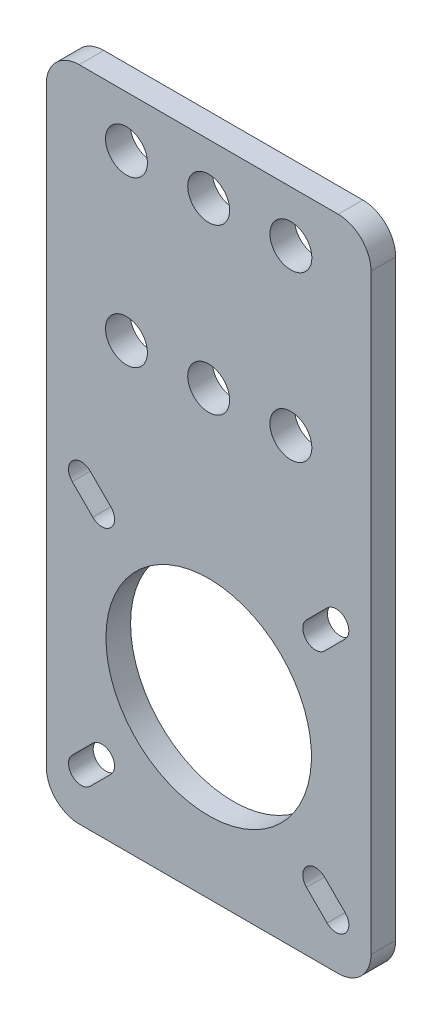
ISO-10303-21;
HEADER;
FILE_DESCRIPTION(('STEP AP214'),'2;1');
FILE_NAME('part.step','',(''),(''),'','','');
FILE_SCHEMA(('AUTOMOTIVE_DESIGN { 1 0 10303 214 1 1 1 1 }'));
ENDSEC;
DATA;
#1=APPLICATION_CONTEXT('core data for automotive mechanical design processes');
#2=APPLICATION_PROTOCOL_DEFINITION('international standard','automotive_design',2000,#1);
#3=PRODUCT_CONTEXT('',#1,'mechanical');
#4=PRODUCT('Part','Part','',(#3));
#5=PRODUCT_RELATED_PRODUCT_CATEGORY('part','',(#4));
#6=PRODUCT_DEFINITION_FORMATION('','',#4);
#7=PRODUCT_DEFINITION_CONTEXT('part definition',#1,'design');
#8=PRODUCT_DEFINITION('design','',#6,#7);
#9=PRODUCT_DEFINITION_SHAPE('','',#8);
#10=(LENGTH_UNIT() NAMED_UNIT(*) SI_UNIT(.MILLI.,.METRE.));
#11=(NAMED_UNIT(*) PLANE_ANGLE_UNIT() SI_UNIT($,.RADIAN.));
#12=(NAMED_UNIT(*) SI_UNIT($,.STERADIAN.) SOLID_ANGLE_UNIT());
#13=UNCERTAINTY_MEASURE_WITH_UNIT(LENGTH_MEASURE(1.E-05),#10,'distance_accuracy_value','');
#14=(GEOMETRIC_REPRESENTATION_CONTEXT(3) GLOBAL_UNCERTAINTY_ASSIGNED_CONTEXT((#13)) GLOBAL_UNIT_ASSIGNED_CONTEXT((#10,
#11,#12)) REPRESENTATION_CONTEXT('',''));
#15=CARTESIAN_POINT('',(0.,0.,0.));
#16=DIRECTION('',(0.,0.,1.));
#17=DIRECTION('',(1.,0.,0.));
#18=AXIS2_PLACEMENT_3D('',#15,#16,#17);
#19=CARTESIAN_POINT('',(0.,52.55,0.));
#20=DIRECTION('',(0.,0.,-1.));
#21=DIRECTION('',(1.,0.,0.));
#22=AXIS2_PLACEMENT_3D('',#19,#20,#21);
#23=CYLINDRICAL_SURFACE('',#22,2.55);
#24=CARTESIAN_POINT('',(0.,52.55,3.));
#25=DIRECTION('',(0.,0.,1.));
#26=DIRECTION('',(1.,0.,0.));
#27=AXIS2_PLACEMENT_3D('',#24,#25,#26);
#28=CIRCLE('',#27,2.55);
#29=CARTESIAN_POINT('',(-2.55,52.55,3.));
#30=VERTEX_POINT('',#29);
#31=EDGE_CURVE('E333',#30,#30,#28,.T.);
#32=ORIENTED_EDGE('',*,*,#31,.T.);
#33=DIRECTION('',(0.,0.,-1.));
#34=VECTOR('',#33,1.);
#35=CARTESIAN_POINT('',(-2.55,52.55,0.));
#36=LINE('',#35,#34);
#37=CARTESIAN_POINT('',(-2.55,52.55,0.));
#38=VERTEX_POINT('',#37);
#39=EDGE_CURVE('E11',#30,#38,#36,.T.);
#40=ORIENTED_EDGE('',*,*,#39,.T.);
#41=CARTESIAN_POINT('',(0.,52.55,0.));
#42=DIRECTION('',(0.,0.,1.));
#43=DIRECTION('',(1.,0.,0.));
#44=AXIS2_PLACEMENT_3D('',#41,#42,#43);
#45=CIRCLE('',#44,2.55);
#46=EDGE_CURVE('E365',#38,#38,#45,.T.);
#47=ORIENTED_EDGE('',*,*,#46,.F.);
#48=ORIENTED_EDGE('',*,*,#39,.F.);
#49=EDGE_LOOP('',(#32,#40,#47,#48));
#50=FACE_BOUND('',#49,.T.);
#51=ADVANCED_FACE('F17',(#50),#23,.F.);
#52=CARTESIAN_POINT('',(0.,32.55,0.));
#53=DIRECTION('',(0.,0.,-1.));
#54=DIRECTION('',(1.,0.,0.));
#55=AXIS2_PLACEMENT_3D('',#52,#53,#54);
#56=CYLINDRICAL_SURFACE('',#55,2.55);
#57=CARTESIAN_POINT('',(0.,32.55,3.));
#58=DIRECTION('',(0.,0.,1.));
#59=DIRECTION('',(1.,0.,0.));
#60=AXIS2_PLACEMENT_3D('',#57,#58,#59);
#61=CIRCLE('',#60,2.55);
#62=CARTESIAN_POINT('',(-2.55,32.55,3.));
#63=VERTEX_POINT('',#62);
#64=EDGE_CURVE('E402',#63,#63,#61,.T.);
#65=ORIENTED_EDGE('',*,*,#64,.T.);
#66=DIRECTION('',(0.,0.,-1.));
#67=VECTOR('',#66,1.);
#68=CARTESIAN_POINT('',(-2.55,32.55,0.));
#69=LINE('',#68,#67);
#70=CARTESIAN_POINT('',(-2.55,32.55,0.));
#71=VERTEX_POINT('',#70);
#72=EDGE_CURVE('E25',#63,#71,#69,.T.);
#73=ORIENTED_EDGE('',*,*,#72,.T.);
#74=CARTESIAN_POINT('',(0.,32.55,0.));
#75=DIRECTION('',(0.,0.,1.));
#76=DIRECTION('',(1.,0.,0.));
#77=AXIS2_PLACEMENT_3D('',#74,#75,#76);
#78=CIRCLE('',#77,2.55);
#79=EDGE_CURVE('E411',#71,#71,#78,.T.);
#80=ORIENTED_EDGE('',*,*,#79,.F.);
#81=ORIENTED_EDGE('',*,*,#72,.F.);
#82=EDGE_LOOP('',(#65,#73,#80,#81));
#83=FACE_BOUND('',#82,.T.);
#84=ADVANCED_FACE('F633',(#83),#56,.F.);
#85=CARTESIAN_POINT('',(-10.,52.55,0.));
#86=DIRECTION('',(0.,0.,-1.));
#87=DIRECTION('',(1.,0.,0.));
#88=AXIS2_PLACEMENT_3D('',#85,#86,#87);
#89=CYLINDRICAL_SURFACE('',#88,2.55);
#90=CARTESIAN_POINT('',(-10.,52.55,3.));
#91=DIRECTION('',(0.,0.,1.));
#92=DIRECTION('',(1.,0.,0.));
#93=AXIS2_PLACEMENT_3D('',#90,#91,#92);
#94=CIRCLE('',#93,2.55);
#95=CARTESIAN_POINT('',(-12.55,52.55,3.));
#96=VERTEX_POINT('',#95);
#97=EDGE_CURVE('E406',#96,#96,#94,.T.);
#98=ORIENTED_EDGE('',*,*,#97,.T.);
#99=DIRECTION('',(0.,0.,-1.));
#100=VECTOR('',#99,1.);
#101=CARTESIAN_POINT('',(-12.55,52.55,0.));
#102=LINE('',#101,#100);
#103=CARTESIAN_POINT('',(-12.55,52.55,0.));
#104=VERTEX_POINT('',#103);
#105=EDGE_CURVE('E527',#96,#104,#102,.T.);
#106=ORIENTED_EDGE('',*,*,#105,.T.);
#107=CARTESIAN_POINT('',(-10.,52.55,0.));
#108=DIRECTION('',(0.,0.,1.));
#109=DIRECTION('',(1.,0.,0.));
#110=AXIS2_PLACEMENT_3D('',#107,#108,#109);
#111=CIRCLE('',#110,2.55);
#112=EDGE_CURVE('E414',#104,#104,#111,.T.);
#113=ORIENTED_EDGE('',*,*,#112,.F.);
#114=ORIENTED_EDGE('',*,*,#105,.F.);
#115=EDGE_LOOP('',(#98,#106,#113,#114));
#116=FACE_BOUND('',#115,.T.);
#117=ADVANCED_FACE('F696',(#116),#89,.F.);
#118=CARTESIAN_POINT('',(-10.,32.55,0.));
#119=DIRECTION('',(0.,0.,-1.));
#120=DIRECTION('',(1.,0.,0.));
#121=AXIS2_PLACEMENT_3D('',#118,#119,#120);
#122=CYLINDRICAL_SURFACE('',#121,2.55);
#123=CARTESIAN_POINT('',(-10.,32.55,3.));
#124=DIRECTION('',(0.,0.,1.));
#125=DIRECTION('',(1.,0.,0.));
#126=AXIS2_PLACEMENT_3D('',#123,#124,#125);
#127=CIRCLE('',#126,2.55);
#128=CARTESIAN_POINT('',(-12.55,32.55,3.));
#129=VERTEX_POINT('',#128);
#130=EDGE_CURVE('E321',#129,#129,#127,.T.);
#131=ORIENTED_EDGE('',*,*,#130,.T.);
#132=DIRECTION('',(0.,0.,-1.));
#133=VECTOR('',#132,1.);
#134=CARTESIAN_POINT('',(-12.55,32.55,0.));
#135=LINE('',#134,#133);
#136=CARTESIAN_POINT('',(-12.55,32.55,0.));
#137=VERTEX_POINT('',#136);
#138=EDGE_CURVE('E357',#129,#137,#135,.T.);
#139=ORIENTED_EDGE('',*,*,#138,.T.);
#140=CARTESIAN_POINT('',(-10.,32.55,0.));
#141=DIRECTION('',(0.,0.,1.));
#142=DIRECTION('',(1.,0.,0.));
#143=AXIS2_PLACEMENT_3D('',#140,#141,#142);
#144=CIRCLE('',#143,2.55);
#145=EDGE_CURVE('E513',#137,#137,#144,.T.);
#146=ORIENTED_EDGE('',*,*,#145,.F.);
#147=ORIENTED_EDGE('',*,*,#138,.F.);
#148=EDGE_LOOP('',(#131,#139,#146,#147));
#149=FACE_BOUND('',#148,.T.);
#150=ADVANCED_FACE('F802',(#149),#122,.F.);
#151=CARTESIAN_POINT('',(10.,52.55,0.));
#152=DIRECTION('',(0.,0.,-1.));
#153=DIRECTION('',(1.,0.,0.));
#154=AXIS2_PLACEMENT_3D('',#151,#152,#153);
#155=CYLINDRICAL_SURFACE('',#154,2.55);
#156=CARTESIAN_POINT('',(10.,52.55,3.));
#157=DIRECTION('',(0.,0.,1.));
#158=DIRECTION('',(1.,0.,0.));
#159=AXIS2_PLACEMENT_3D('',#156,#157,#158);
#160=CIRCLE('',#159,2.55);
#161=CARTESIAN_POINT('',(7.45,52.55,3.));
#162=VERTEX_POINT('',#161);
#163=EDGE_CURVE('E470',#162,#162,#160,.T.);
#164=ORIENTED_EDGE('',*,*,#163,.T.);
#165=DIRECTION('',(0.,0.,-1.));
#166=VECTOR('',#165,1.);
#167=CARTESIAN_POINT('',(7.45,52.55,0.));
#168=LINE('',#167,#166);
#169=CARTESIAN_POINT('',(7.45,52.55,0.));
#170=VERTEX_POINT('',#169);
#171=EDGE_CURVE('E356',#162,#170,#168,.T.);
#172=ORIENTED_EDGE('',*,*,#171,.T.);
#173=CARTESIAN_POINT('',(10.,52.55,0.));
#174=DIRECTION('',(0.,0.,1.));
#175=DIRECTION('',(1.,0.,0.));
#176=AXIS2_PLACEMENT_3D('',#173,#174,#175);
#177=CIRCLE('',#176,2.55);
#178=EDGE_CURVE('E507',#170,#170,#177,.T.);
#179=ORIENTED_EDGE('',*,*,#178,.F.);
#180=ORIENTED_EDGE('',*,*,#171,.F.);
#181=EDGE_LOOP('',(#164,#172,#179,#180));
#182=FACE_BOUND('',#181,.T.);
#183=ADVANCED_FACE('F798',(#182),#155,.F.);
#184=CARTESIAN_POINT('',(10.,32.55,0.));
#185=DIRECTION('',(0.,0.,-1.));
#186=DIRECTION('',(1.,0.,0.));
#187=AXIS2_PLACEMENT_3D('',#184,#185,#186);
#188=CYLINDRICAL_SURFACE('',#187,2.55);
#189=CARTESIAN_POINT('',(10.,32.55,3.));
#190=DIRECTION('',(0.,0.,1.));
#191=DIRECTION('',(1.,0.,0.));
#192=AXIS2_PLACEMENT_3D('',#189,#190,#191);
#193=CIRCLE('',#192,2.55);
#194=CARTESIAN_POINT('',(7.45,32.55,3.));
#195=VERTEX_POINT('',#194);
#196=EDGE_CURVE('E473',#195,#195,#193,.T.);
#197=ORIENTED_EDGE('',*,*,#196,.T.);
#198=DIRECTION('',(0.,0.,-1.));
#199=VECTOR('',#198,1.);
#200=CARTESIAN_POINT('',(7.45,32.55,0.));
#201=LINE('',#200,#199);
#202=CARTESIAN_POINT('',(7.45,32.55,0.));
#203=VERTEX_POINT('',#202);
#204=EDGE_CURVE('E359',#195,#203,#201,.T.);
#205=ORIENTED_EDGE('',*,*,#204,.T.);
#206=CARTESIAN_POINT('',(10.,32.55,0.));
#207=DIRECTION('',(0.,0.,1.));
#208=DIRECTION('',(1.,0.,0.));
#209=AXIS2_PLACEMENT_3D('',#206,#207,#208);
#210=CIRCLE('',#209,2.55);
#211=EDGE_CURVE('E499',#203,#203,#210,.T.);
#212=ORIENTED_EDGE('',*,*,#211,.F.);
#213=ORIENTED_EDGE('',*,*,#204,.F.);
#214=EDGE_LOOP('',(#197,#205,#212,#213));
#215=FACE_BOUND('',#214,.T.);
#216=ADVANCED_FACE('F793',(#215),#188,.F.);
#217=CARTESIAN_POINT('',(16.596015510839,-14.40398448916,0.));
#218=DIRECTION('',(-0.707106781186548,-0.707106781186548,0.));
#219=DIRECTION('',(-0.707106781186548,0.707106781186548,0.));
#220=AXIS2_PLACEMENT_3D('',#217,#218,#219);
#221=PLANE('',#220);
#222=DIRECTION('',(0.,0.,1.));
#223=VECTOR('',#222,1.);
#224=CARTESIAN_POINT('',(16.596015510839,-14.40398448916,0.));
#225=LINE('',#224,#223);
#226=CARTESIAN_POINT('',(16.596015510839,-14.40398448916,0.));
#227=VERTEX_POINT('',#226);
#228=CARTESIAN_POINT('',(16.596015510839,-14.40398448916,3.));
#229=VERTEX_POINT('',#228);
#230=EDGE_CURVE('E502',#227,#229,#225,.T.);
#231=ORIENTED_EDGE('',*,*,#230,.T.);
#232=DIRECTION('',(-0.707106781186548,0.707106781186548,0.));
#233=VECTOR('',#232,1.);
#234=CARTESIAN_POINT('',(16.596015510839,-14.40398448916,3.));
#235=LINE('',#234,#233);
#236=CARTESIAN_POINT('',(14.096015510839,-11.90398448916,3.));
#237=VERTEX_POINT('',#236);
#238=EDGE_CURVE('E580',#229,#237,#235,.T.);
#239=ORIENTED_EDGE('',*,*,#238,.T.);
#240=DIRECTION('',(0.,0.,1.));
#241=VECTOR('',#240,1.);
#242=CARTESIAN_POINT('',(14.096015510839,-11.90398448916,0.));
#243=LINE('',#242,#241);
#244=CARTESIAN_POINT('',(14.096015510839,-11.90398448916,0.));
#245=VERTEX_POINT('',#244);
#246=EDGE_CURVE('E338',#245,#237,#243,.T.);
#247=ORIENTED_EDGE('',*,*,#246,.F.);
#248=DIRECTION('',(-0.707106781186548,0.707106781186548,0.));
#249=VECTOR('',#248,1.);
#250=CARTESIAN_POINT('',(16.596015510839,-14.40398448916,0.));
#251=LINE('',#250,#249);
#252=EDGE_CURVE('E493',#227,#245,#251,.T.);
#253=ORIENTED_EDGE('',*,*,#252,.F.);
#254=EDGE_LOOP('',(#231,#239,#247,#253));
#255=FACE_BOUND('',#254,.T.);
#256=ADVANCED_FACE('F789',(#255),#221,.T.);
#257=CARTESIAN_POINT('',(15.5,-15.5,0.));
#258=DIRECTION('',(0.,0.,-1.));
#259=DIRECTION('',(1.,0.,0.));
#260=AXIS2_PLACEMENT_3D('',#257,#258,#259);
#261=CYLINDRICAL_SURFACE('',#260,1.55);
#262=DIRECTION('',(0.,0.,1.));
#263=VECTOR('',#262,1.);
#264=CARTESIAN_POINT('',(14.403984489161,-16.59601551083,0.));
#265=LINE('',#264,#263);
#266=CARTESIAN_POINT('',(14.403984489161,-16.59601551083,0.));
#267=VERTEX_POINT('',#266);
#268=CARTESIAN_POINT('',(14.403984489161,-16.59601551083,3.));
#269=VERTEX_POINT('',#268);
#270=EDGE_CURVE('E496',#267,#269,#265,.T.);
#271=ORIENTED_EDGE('',*,*,#270,.T.);
#272=CARTESIAN_POINT('',(15.5,-15.5,3.));
#273=DIRECTION('',(0.,0.,1.));
#274=DIRECTION('',(1.,0.,0.));
#275=AXIS2_PLACEMENT_3D('',#272,#273,#274);
#276=CIRCLE('',#275,1.55);
#277=EDGE_CURVE('E583',#269,#229,#276,.T.);
#278=ORIENTED_EDGE('',*,*,#277,.T.);
#279=ORIENTED_EDGE('',*,*,#230,.F.);
#280=CARTESIAN_POINT('',(15.5,-15.5,0.));
#281=DIRECTION('',(0.,0.,1.));
#282=DIRECTION('',(1.,0.,0.));
#283=AXIS2_PLACEMENT_3D('',#280,#281,#282);
#284=CIRCLE('',#283,1.55);
#285=EDGE_CURVE('E489',#267,#227,#284,.T.);
#286=ORIENTED_EDGE('',*,*,#285,.F.);
#287=EDGE_LOOP('',(#271,#278,#279,#286));
#288=FACE_BOUND('',#287,.T.);
#289=ADVANCED_FACE('F790',(#288),#261,.F.);
#290=CARTESIAN_POINT('',(11.903984489161,-14.09601551083,0.));
#291=DIRECTION('',(0.707106781186548,0.707106781186548,0.));
#292=DIRECTION('',(0.,0.,-1.));
#293=AXIS2_PLACEMENT_3D('',#290,#291,#292);
#294=PLANE('',#293);
#295=DIRECTION('',(0.,0.,1.));
#296=VECTOR('',#295,1.);
#297=CARTESIAN_POINT('',(11.903984489161,-14.09601551083,0.));
#298=LINE('',#297,#296);
#299=CARTESIAN_POINT('',(11.903984489161,-14.09601551083,0.));
#300=VERTEX_POINT('',#299);
#301=CARTESIAN_POINT('',(11.903984489161,-14.09601551083,3.));
#302=VERTEX_POINT('',#301);
#303=EDGE_CURVE('E345',#300,#302,#298,.T.);
#304=ORIENTED_EDGE('',*,*,#303,.T.);
#305=DIRECTION('',(0.707106781186548,-0.707106781186548,0.));
#306=VECTOR('',#305,1.);
#307=CARTESIAN_POINT('',(11.903984489161,-14.09601551083,3.));
#308=LINE('',#307,#306);
#309=EDGE_CURVE('E584',#302,#269,#308,.T.);
#310=ORIENTED_EDGE('',*,*,#309,.T.);
#311=ORIENTED_EDGE('',*,*,#270,.F.);
#312=DIRECTION('',(0.707106781186548,-0.707106781186548,0.));
#313=VECTOR('',#312,1.);
#314=CARTESIAN_POINT('',(11.903984489161,-14.09601551083,0.));
#315=LINE('',#314,#313);
#316=EDGE_CURVE('E474',#300,#267,#315,.T.);
#317=ORIENTED_EDGE('',*,*,#316,.F.);
#318=EDGE_LOOP('',(#304,#310,#311,#317));
#319=FACE_BOUND('',#318,.T.);
#320=ADVANCED_FACE('F785',(#319),#294,.T.);
#321=CARTESIAN_POINT('',(13.,-13.,0.));
#322=DIRECTION('',(0.,0.,-1.));
#323=DIRECTION('',(-0.707106781185256,0.707106781187839,0.));
#324=AXIS2_PLACEMENT_3D('',#321,#322,#323);
#325=CYLINDRICAL_SURFACE('',#324,1.55);
#326=ORIENTED_EDGE('',*,*,#246,.T.);
#327=CARTESIAN_POINT('',(13.,-13.,3.));
#328=DIRECTION('',(0.,0.,1.));
#329=DIRECTION('',(1.,0.,0.));
#330=AXIS2_PLACEMENT_3D('',#327,#328,#329);
#331=CIRCLE('',#330,1.55);
#332=EDGE_CURVE('E433',#237,#302,#331,.T.);
#333=ORIENTED_EDGE('',*,*,#332,.T.);
#334=ORIENTED_EDGE('',*,*,#303,.F.);
#335=CARTESIAN_POINT('',(13.,-13.,0.));
#336=DIRECTION('',(0.,0.,1.));
#337=DIRECTION('',(1.,0.,0.));
#338=AXIS2_PLACEMENT_3D('',#335,#336,#337);
#339=CIRCLE('',#338,1.55);
#340=EDGE_CURVE('E466',#245,#300,#339,.T.);
#341=ORIENTED_EDGE('',*,*,#340,.F.);
#342=EDGE_LOOP('',(#326,#333,#334,#341));
#343=FACE_BOUND('',#342,.T.);
#344=ADVANCED_FACE('F779',(#343),#325,.F.);
#345=CARTESIAN_POINT('',(14.403984489161,16.596015510839,0.));
#346=DIRECTION('',(0.707106781186548,-0.707106781186548,0.));
#347=DIRECTION('',(0.,0.,-1.));
#348=AXIS2_PLACEMENT_3D('',#345,#346,#347);
#349=PLANE('',#348);
#350=DIRECTION('',(0.,0.,1.));
#351=VECTOR('',#350,1.);
#352=CARTESIAN_POINT('',(14.403984489161,16.596015510839,0.));
#353=LINE('',#352,#351);
#354=CARTESIAN_POINT('',(14.403984489161,16.596015510839,0.));
#355=VERTEX_POINT('',#354);
#356=CARTESIAN_POINT('',(14.403984489161,16.596015510839,3.));
#357=VERTEX_POINT('',#356);
#358=EDGE_CURVE('E344',#355,#357,#353,.T.);
#359=ORIENTED_EDGE('',*,*,#358,.T.);
#360=DIRECTION('',(-0.707106781186548,-0.707106781186548,0.));
#361=VECTOR('',#360,1.);
#362=CARTESIAN_POINT('',(14.403984489161,16.596015510839,3.));
#363=LINE('',#362,#361);
#364=CARTESIAN_POINT('',(11.903984489161,14.096015510839,3.));
#365=VERTEX_POINT('',#364);
#366=EDGE_CURVE('E397',#357,#365,#363,.T.);
#367=ORIENTED_EDGE('',*,*,#366,.T.);
#368=DIRECTION('',(0.,0.,1.));
#369=VECTOR('',#368,1.);
#370=CARTESIAN_POINT('',(11.903984489161,14.096015510839,0.));
#371=LINE('',#370,#369);
#372=CARTESIAN_POINT('',(11.903984489161,14.096015510839,0.));
#373=VERTEX_POINT('',#372);
#374=EDGE_CURVE('E589',#373,#365,#371,.T.);
#375=ORIENTED_EDGE('',*,*,#374,.F.);
#376=DIRECTION('',(-0.707106781186548,-0.707106781186548,0.));
#377=VECTOR('',#376,1.);
#378=CARTESIAN_POINT('',(14.403984489161,16.596015510839,0.));
#379=LINE('',#378,#377);
#380=EDGE_CURVE('E457',#355,#373,#379,.T.);
#381=ORIENTED_EDGE('',*,*,#380,.F.);
#382=EDGE_LOOP('',(#359,#367,#375,#381));
#383=FACE_BOUND('',#382,.T.);
#384=ADVANCED_FACE('F771',(#383),#349,.T.);
#385=CARTESIAN_POINT('',(15.5,15.5,0.));
#386=DIRECTION('',(0.,0.,-1.));
#387=DIRECTION('',(1.,0.,0.));
#388=AXIS2_PLACEMENT_3D('',#385,#386,#387);
#389=CYLINDRICAL_SURFACE('',#388,1.55);
#390=DIRECTION('',(0.,0.,1.));
#391=VECTOR('',#390,1.);
#392=CARTESIAN_POINT('',(16.596015510839,14.403984489161,0.));
#393=LINE('',#392,#391);
#394=CARTESIAN_POINT('',(16.596015510839,14.403984489161,0.));
#395=VERTEX_POINT('',#394);
#396=CARTESIAN_POINT('',(16.596015510839,14.403984489161,3.));
#397=VERTEX_POINT('',#396);
#398=EDGE_CURVE('E618',#395,#397,#393,.T.);
#399=ORIENTED_EDGE('',*,*,#398,.T.);
#400=CARTESIAN_POINT('',(15.5,15.5,3.));
#401=DIRECTION('',(0.,0.,1.));
#402=DIRECTION('',(1.,0.,0.));
#403=AXIS2_PLACEMENT_3D('',#400,#401,#402);
#404=CIRCLE('',#403,1.55);
#405=EDGE_CURVE('E398',#397,#357,#404,.T.);
#406=ORIENTED_EDGE('',*,*,#405,.T.);
#407=ORIENTED_EDGE('',*,*,#358,.F.);
#408=CARTESIAN_POINT('',(15.5,15.5,0.));
#409=DIRECTION('',(0.,0.,1.));
#410=DIRECTION('',(1.,0.,0.));
#411=AXIS2_PLACEMENT_3D('',#408,#409,#410);
#412=CIRCLE('',#411,1.55);
#413=EDGE_CURVE('E448',#395,#355,#412,.T.);
#414=ORIENTED_EDGE('',*,*,#413,.F.);
#415=EDGE_LOOP('',(#399,#406,#407,#414));
#416=FACE_BOUND('',#415,.T.);
#417=ADVANCED_FACE('F769',(#416),#389,.F.);
#418=CARTESIAN_POINT('',(14.096015510839,11.903984489161,0.));
#419=DIRECTION('',(-0.707106781186548,0.707106781186548,0.));
#420=DIRECTION('',(0.,0.,1.));
#421=AXIS2_PLACEMENT_3D('',#418,#419,#420);
#422=PLANE('',#421);
#423=DIRECTION('',(0.,0.,1.));
#424=VECTOR('',#423,1.);
#425=CARTESIAN_POINT('',(14.096015510839,11.903984489161,0.));
#426=LINE('',#425,#424);
#427=CARTESIAN_POINT('',(14.096015510839,11.903984489161,0.));
#428=VERTEX_POINT('',#427);
#429=CARTESIAN_POINT('',(14.096015510839,11.903984489161,3.));
#430=VERTEX_POINT('',#429);
#431=EDGE_CURVE('E595',#428,#430,#426,.T.);
#432=ORIENTED_EDGE('',*,*,#431,.T.);
#433=DIRECTION('',(0.707106781186548,0.707106781186548,0.));
#434=VECTOR('',#433,1.);
#435=CARTESIAN_POINT('',(14.096015510839,11.903984489161,3.));
#436=LINE('',#435,#434);
#437=EDGE_CURVE('E427',#430,#397,#436,.T.);
#438=ORIENTED_EDGE('',*,*,#437,.T.);
#439=ORIENTED_EDGE('',*,*,#398,.F.);
#440=DIRECTION('',(0.707106781186548,0.707106781186548,0.));
#441=VECTOR('',#440,1.);
#442=CARTESIAN_POINT('',(14.096015510839,11.903984489161,0.));
#443=LINE('',#442,#441);
#444=EDGE_CURVE('E443',#428,#395,#443,.T.);
#445=ORIENTED_EDGE('',*,*,#444,.F.);
#446=EDGE_LOOP('',(#432,#438,#439,#445));
#447=FACE_BOUND('',#446,.T.);
#448=ADVANCED_FACE('F766',(#447),#422,.T.);
#449=CARTESIAN_POINT('',(13.,13.,0.));
#450=DIRECTION('',(0.,0.,-1.));
#451=DIRECTION('',(-0.707106781186548,-0.707106781186547,0.));
#452=AXIS2_PLACEMENT_3D('',#449,#450,#451);
#453=CYLINDRICAL_SURFACE('',#452,1.55);
#454=ORIENTED_EDGE('',*,*,#374,.T.);
#455=CARTESIAN_POINT('',(13.,13.,3.));
#456=DIRECTION('',(0.,0.,1.));
#457=DIRECTION('',(1.,0.,0.));
#458=AXIS2_PLACEMENT_3D('',#455,#456,#457);
#459=CIRCLE('',#458,1.55);
#460=EDGE_CURVE('E405',#365,#430,#459,.T.);
#461=ORIENTED_EDGE('',*,*,#460,.T.);
#462=ORIENTED_EDGE('',*,*,#431,.F.);
#463=CARTESIAN_POINT('',(13.,13.,0.));
#464=DIRECTION('',(0.,0.,1.));
#465=DIRECTION('',(1.,0.,0.));
#466=AXIS2_PLACEMENT_3D('',#463,#464,#465);
#467=CIRCLE('',#466,1.55);
#468=EDGE_CURVE('E442',#373,#428,#467,.T.);
#469=ORIENTED_EDGE('',*,*,#468,.F.);
#470=EDGE_LOOP('',(#454,#461,#462,#469));
#471=FACE_BOUND('',#470,.T.);
#472=ADVANCED_FACE('F765',(#471),#453,.F.);
#473=CARTESIAN_POINT('',(-14.09601551083,-11.90398448916,0.));
#474=DIRECTION('',(0.707106781186548,-0.707106781186548,0.));
#475=DIRECTION('',(0.,0.,-1.));
#476=AXIS2_PLACEMENT_3D('',#473,#474,#475);
#477=PLANE('',#476);
#478=DIRECTION('',(0.,0.,1.));
#479=VECTOR('',#478,1.);
#480=CARTESIAN_POINT('',(-14.09601551083,-11.90398448916,0.));
#481=LINE('',#480,#479);
#482=CARTESIAN_POINT('',(-14.09601551083,-11.90398448916,0.));
#483=VERTEX_POINT('',#482);
#484=CARTESIAN_POINT('',(-14.09601551083,-11.90398448916,3.));
#485=VERTEX_POINT('',#484);
#486=EDGE_CURVE('E421',#483,#485,#481,.T.);
#487=ORIENTED_EDGE('',*,*,#486,.T.);
#488=DIRECTION('',(-0.707106781186548,-0.707106781186548,0.));
#489=VECTOR('',#488,1.);
#490=CARTESIAN_POINT('',(-14.09601551083,-11.90398448916,3.));
#491=LINE('',#490,#489);
#492=CARTESIAN_POINT('',(-16.59601551083,-14.40398448916,3.));
#493=VERTEX_POINT('',#492);
#494=EDGE_CURVE('E481',#485,#493,#491,.T.);
#495=ORIENTED_EDGE('',*,*,#494,.T.);
#496=DIRECTION('',(0.,0.,1.));
#497=VECTOR('',#496,1.);
#498=CARTESIAN_POINT('',(-16.59601551083,-14.40398448916,0.));
#499=LINE('',#498,#497);
#500=CARTESIAN_POINT('',(-16.59601551083,-14.40398448916,0.));
#501=VERTEX_POINT('',#500);
#502=EDGE_CURVE('E520',#501,#493,#499,.T.);
#503=ORIENTED_EDGE('',*,*,#502,.F.);
#504=DIRECTION('',(-0.707106781186548,-0.707106781186548,0.));
#505=VECTOR('',#504,1.);
#506=CARTESIAN_POINT('',(-14.09601551083,-11.90398448916,0.));
#507=LINE('',#506,#505);
#508=EDGE_CURVE('E440',#483,#501,#507,.T.);
#509=ORIENTED_EDGE('',*,*,#508,.F.);
#510=EDGE_LOOP('',(#487,#495,#503,#509));
#511=FACE_BOUND('',#510,.T.);
#512=ADVANCED_FACE('F758',(#511),#477,.T.);
#513=CARTESIAN_POINT('',(-13.,-13.,0.));
#514=DIRECTION('',(0.,0.,-1.));
#515=DIRECTION('',(1.,0.,0.));
#516=AXIS2_PLACEMENT_3D('',#513,#514,#515);
#517=CYLINDRICAL_SURFACE('',#516,1.55);
#518=DIRECTION('',(0.,0.,1.));
#519=VECTOR('',#518,1.);
#520=CARTESIAN_POINT('',(-11.90398448916,-14.09601551083,0.));
#521=LINE('',#520,#519);
#522=CARTESIAN_POINT('',(-11.90398448916,-14.09601551083,0.));
#523=VERTEX_POINT('',#522);
#524=CARTESIAN_POINT('',(-11.90398448916,-14.09601551083,3.));
#525=VERTEX_POINT('',#524);
#526=EDGE_CURVE('E419',#523,#525,#521,.T.);
#527=ORIENTED_EDGE('',*,*,#526,.T.);
#528=CARTESIAN_POINT('',(-13.,-13.,3.));
#529=DIRECTION('',(0.,0.,1.));
#530=DIRECTION('',(1.,0.,0.));
#531=AXIS2_PLACEMENT_3D('',#528,#529,#530);
#532=CIRCLE('',#531,1.55);
#533=EDGE_CURVE('E484',#525,#485,#532,.T.);
#534=ORIENTED_EDGE('',*,*,#533,.T.);
#535=ORIENTED_EDGE('',*,*,#486,.F.);
#536=CARTESIAN_POINT('',(-13.,-13.,0.));
#537=DIRECTION('',(0.,0.,1.));
#538=DIRECTION('',(1.,0.,0.));
#539=AXIS2_PLACEMENT_3D('',#536,#537,#538);
#540=CIRCLE('',#539,1.55);
#541=EDGE_CURVE('E428',#523,#483,#540,.T.);
#542=ORIENTED_EDGE('',*,*,#541,.F.);
#543=EDGE_LOOP('',(#527,#534,#535,#542));
#544=FACE_BOUND('',#543,.T.);
#545=ADVANCED_FACE('F754',(#544),#517,.F.);
#546=CARTESIAN_POINT('',(-14.40398448916,-16.59601551083,0.));
#547=DIRECTION('',(-0.707106781186548,0.707106781186548,0.));
#548=DIRECTION('',(0.,0.,1.));
#549=AXIS2_PLACEMENT_3D('',#546,#547,#548);
#550=PLANE('',#549);
#551=DIRECTION('',(0.,0.,1.));
#552=VECTOR('',#551,1.);
#553=CARTESIAN_POINT('',(-14.40398448916,-16.59601551083,0.));
#554=LINE('',#553,#552);
#555=CARTESIAN_POINT('',(-14.40398448916,-16.59601551083,0.));
#556=VERTEX_POINT('',#555);
#557=CARTESIAN_POINT('',(-14.40398448916,-16.59601551083,3.));
#558=VERTEX_POINT('',#557);
#559=EDGE_CURVE('E424',#556,#558,#554,.T.);
#560=ORIENTED_EDGE('',*,*,#559,.T.);
#561=DIRECTION('',(0.707106781186548,0.707106781186548,0.));
#562=VECTOR('',#561,1.);
#563=CARTESIAN_POINT('',(-14.40398448916,-16.59601551083,3.));
#564=LINE('',#563,#562);
#565=EDGE_CURVE('E561',#558,#525,#564,.T.);
#566=ORIENTED_EDGE('',*,*,#565,.T.);
#567=ORIENTED_EDGE('',*,*,#526,.F.);
#568=DIRECTION('',(0.707106781186548,0.707106781186548,0.));
#569=VECTOR('',#568,1.);
#570=CARTESIAN_POINT('',(-14.40398448916,-16.59601551083,0.));
#571=LINE('',#570,#569);
#572=EDGE_CURVE('E420',#556,#523,#571,.T.);
#573=ORIENTED_EDGE('',*,*,#572,.F.);
#574=EDGE_LOOP('',(#560,#566,#567,#573));
#575=FACE_BOUND('',#574,.T.);
#576=ADVANCED_FACE('F753',(#575),#550,.T.);
#577=CARTESIAN_POINT('',(-15.5,-15.5,0.));
#578=DIRECTION('',(0.,0.,-1.));
#579=DIRECTION('',(-0.707106781186548,-0.707106781186547,0.));
#580=AXIS2_PLACEMENT_3D('',#577,#578,#579);
#581=CYLINDRICAL_SURFACE('',#580,1.55);
#582=ORIENTED_EDGE('',*,*,#502,.T.);
#583=CARTESIAN_POINT('',(-15.5,-15.5,3.));
#584=DIRECTION('',(0.,0.,1.));
#585=DIRECTION('',(1.,0.,0.));
#586=AXIS2_PLACEMENT_3D('',#583,#584,#585);
#587=CIRCLE('',#586,1.55);
#588=EDGE_CURVE('E486',#493,#558,#587,.T.);
#589=ORIENTED_EDGE('',*,*,#588,.T.);
#590=ORIENTED_EDGE('',*,*,#559,.F.);
#591=CARTESIAN_POINT('',(-15.5,-15.5,0.));
#592=DIRECTION('',(0.,0.,1.));
#593=DIRECTION('',(1.,0.,0.));
#594=AXIS2_PLACEMENT_3D('',#591,#592,#593);
#595=CIRCLE('',#594,1.55);
#596=EDGE_CURVE('E369',#501,#556,#595,.T.);
#597=ORIENTED_EDGE('',*,*,#596,.F.);
#598=EDGE_LOOP('',(#582,#589,#590,#597));
#599=FACE_BOUND('',#598,.T.);
#600=ADVANCED_FACE('F749',(#599),#581,.F.);
#601=CARTESIAN_POINT('',(-11.90398448916,14.096015510839,0.));
#602=DIRECTION('',(-0.707106781186548,-0.707106781186548,0.));
#603=DIRECTION('',(-0.707106781186548,0.707106781186548,0.));
#604=AXIS2_PLACEMENT_3D('',#601,#602,#603);
#605=PLANE('',#604);
#606=DIRECTION('',(0.,0.,1.));
#607=VECTOR('',#606,1.);
#608=CARTESIAN_POINT('',(-11.90398448916,14.096015510839,0.));
#609=LINE('',#608,#607);
#610=CARTESIAN_POINT('',(-11.90398448916,14.096015510839,0.));
#611=VERTEX_POINT('',#610);
#612=CARTESIAN_POINT('',(-11.90398448916,14.096015510839,3.));
#613=VERTEX_POINT('',#612);
#614=EDGE_CURVE('E512',#611,#613,#609,.T.);
#615=ORIENTED_EDGE('',*,*,#614,.T.);
#616=DIRECTION('',(-0.707106781186548,0.707106781186548,0.));
#617=VECTOR('',#616,1.);
#618=CARTESIAN_POINT('',(-11.90398448916,14.096015510839,3.));
#619=LINE('',#618,#617);
#620=CARTESIAN_POINT('',(-14.40398448916,16.596015510839,3.));
#621=VERTEX_POINT('',#620);
#622=EDGE_CURVE('E381',#613,#621,#619,.T.);
#623=ORIENTED_EDGE('',*,*,#622,.T.);
#624=DIRECTION('',(0.,0.,1.));
#625=VECTOR('',#624,1.);
#626=CARTESIAN_POINT('',(-14.40398448916,16.596015510839,0.));
#627=LINE('',#626,#625);
#628=CARTESIAN_POINT('',(-14.40398448916,16.596015510839,0.));
#629=VERTEX_POINT('',#628);
#630=EDGE_CURVE('E479',#629,#621,#627,.T.);
#631=ORIENTED_EDGE('',*,*,#630,.F.);
#632=DIRECTION('',(-0.707106781186548,0.707106781186548,0.));
#633=VECTOR('',#632,1.);
#634=CARTESIAN_POINT('',(-11.90398448916,14.096015510839,0.));
#635=LINE('',#634,#633);
#636=EDGE_CURVE('E364',#611,#629,#635,.T.);
#637=ORIENTED_EDGE('',*,*,#636,.F.);
#638=EDGE_LOOP('',(#615,#623,#631,#637));
#639=FACE_BOUND('',#638,.T.);
#640=ADVANCED_FACE('F731',(#639),#605,.T.);
#641=CARTESIAN_POINT('',(-13.,13.,0.));
#642=DIRECTION('',(0.,0.,-1.));
#643=DIRECTION('',(1.,0.,0.));
#644=AXIS2_PLACEMENT_3D('',#641,#642,#643);
#645=CYLINDRICAL_SURFACE('',#644,1.55);
#646=DIRECTION('',(0.,0.,1.));
#647=VECTOR('',#646,1.);
#648=CARTESIAN_POINT('',(-14.09601551083,11.903984489161,0.));
#649=LINE('',#648,#647);
#650=CARTESIAN_POINT('',(-14.09601551083,11.903984489161,0.));
#651=VERTEX_POINT('',#650);
#652=CARTESIAN_POINT('',(-14.09601551083,11.903984489161,3.));
#653=VERTEX_POINT('',#652);
#654=EDGE_CURVE('E517',#651,#653,#649,.T.);
#655=ORIENTED_EDGE('',*,*,#654,.T.);
#656=CARTESIAN_POINT('',(-13.,13.,3.));
#657=DIRECTION('',(0.,0.,1.));
#658=DIRECTION('',(1.,0.,0.));
#659=AXIS2_PLACEMENT_3D('',#656,#657,#658);
#660=CIRCLE('',#659,1.55);
#661=EDGE_CURVE('E549',#653,#613,#660,.T.);
#662=ORIENTED_EDGE('',*,*,#661,.T.);
#663=ORIENTED_EDGE('',*,*,#614,.F.);
#664=CARTESIAN_POINT('',(-13.,13.,0.));
#665=DIRECTION('',(0.,0.,1.));
#666=DIRECTION('',(1.,0.,0.));
#667=AXIS2_PLACEMENT_3D('',#664,#665,#666);
#668=CIRCLE('',#667,1.55);
#669=EDGE_CURVE('E328',#651,#611,#668,.T.);
#670=ORIENTED_EDGE('',*,*,#669,.F.);
#671=EDGE_LOOP('',(#655,#662,#663,#670));
#672=FACE_BOUND('',#671,.T.);
#673=ADVANCED_FACE('F734',(#672),#645,.F.);
#674=CARTESIAN_POINT('',(-16.59601551083,14.403984489161,0.));
#675=DIRECTION('',(0.707106781186548,0.707106781186548,0.));
#676=DIRECTION('',(0.,0.,-1.));
#677=AXIS2_PLACEMENT_3D('',#674,#675,#676);
#678=PLANE('',#677);
#679=DIRECTION('',(0.,0.,1.));
#680=VECTOR('',#679,1.);
#681=CARTESIAN_POINT('',(-16.59601551083,14.403984489161,0.));
#682=LINE('',#681,#680);
#683=CARTESIAN_POINT('',(-16.59601551083,14.403984489161,0.));
#684=VERTEX_POINT('',#683);
#685=CARTESIAN_POINT('',(-16.59601551083,14.403984489161,3.));
#686=VERTEX_POINT('',#685);
#687=EDGE_CURVE('E606',#684,#686,#682,.T.);
#688=ORIENTED_EDGE('',*,*,#687,.T.);
#689=DIRECTION('',(0.707106781186548,-0.707106781186548,0.));
#690=VECTOR('',#689,1.);
#691=CARTESIAN_POINT('',(-16.59601551083,14.403984489161,3.));
#692=LINE('',#691,#690);
#693=EDGE_CURVE('E551',#686,#653,#692,.T.);
#694=ORIENTED_EDGE('',*,*,#693,.T.);
#695=ORIENTED_EDGE('',*,*,#654,.F.);
#696=DIRECTION('',(0.707106781186548,-0.707106781186548,0.));
#697=VECTOR('',#696,1.);
#698=CARTESIAN_POINT('',(-16.59601551083,14.403984489161,0.));
#699=LINE('',#698,#697);
#700=EDGE_CURVE('E324',#684,#651,#699,.T.);
#701=ORIENTED_EDGE('',*,*,#700,.F.);
#702=EDGE_LOOP('',(#688,#694,#695,#701));
#703=FACE_BOUND('',#702,.T.);
#704=ADVANCED_FACE('F740',(#703),#678,.T.);
#705=CARTESIAN_POINT('',(-15.5,15.5,0.));
#706=DIRECTION('',(0.,0.,-1.));
#707=DIRECTION('',(-0.707106781187838,0.707106781185257,0.));
#708=AXIS2_PLACEMENT_3D('',#705,#706,#707);
#709=CYLINDRICAL_SURFACE('',#708,1.55);
#710=ORIENTED_EDGE('',*,*,#630,.T.);
#711=CARTESIAN_POINT('',(-15.5,15.5,3.));
#712=DIRECTION('',(0.,0.,1.));
#713=DIRECTION('',(1.,0.,0.));
#714=AXIS2_PLACEMENT_3D('',#711,#712,#713);
#715=CIRCLE('',#714,1.55);
#716=EDGE_CURVE('E380',#621,#686,#715,.T.);
#717=ORIENTED_EDGE('',*,*,#716,.T.);
#718=ORIENTED_EDGE('',*,*,#687,.F.);
#719=CARTESIAN_POINT('',(-15.5,15.5,0.));
#720=DIRECTION('',(0.,0.,1.));
#721=DIRECTION('',(1.,0.,0.));
#722=AXIS2_PLACEMENT_3D('',#719,#720,#721);
#723=CIRCLE('',#722,1.55);
#724=EDGE_CURVE('E329',#629,#684,#723,.T.);
#725=ORIENTED_EDGE('',*,*,#724,.F.);
#726=EDGE_LOOP('',(#710,#717,#718,#725));
#727=FACE_BOUND('',#726,.T.);
#728=ADVANCED_FACE('F729',(#727),#709,.F.);
#729=CARTESIAN_POINT('',(0.,0.,0.));
#730=DIRECTION('',(0.,0.,-1.));
#731=DIRECTION('',(1.,0.,0.));
#732=AXIS2_PLACEMENT_3D('',#729,#730,#731);
#733=CYLINDRICAL_SURFACE('',#732,12.5);
#734=CARTESIAN_POINT('',(0.,0.,3.));
#735=DIRECTION('',(0.,0.,1.));
#736=DIRECTION('',(1.,0.,0.));
#737=AXIS2_PLACEMENT_3D('',#734,#735,#736);
#738=CIRCLE('',#737,12.5);
#739=CARTESIAN_POINT('',(-12.5,0.,3.));
#740=VERTEX_POINT('',#739);
#741=EDGE_CURVE('E385',#740,#740,#738,.T.);
#742=ORIENTED_EDGE('',*,*,#741,.T.);
#743=DIRECTION('',(0.,0.,-1.));
#744=VECTOR('',#743,1.);
#745=CARTESIAN_POINT('',(-12.5,0.,0.));
#746=LINE('',#745,#744);
#747=CARTESIAN_POINT('',(-12.5,0.,0.));
#748=VERTEX_POINT('',#747);
#749=EDGE_CURVE('E478',#740,#748,#746,.T.);
#750=ORIENTED_EDGE('',*,*,#749,.T.);
#751=CARTESIAN_POINT('',(0.,0.,0.));
#752=DIRECTION('',(0.,0.,1.));
#753=DIRECTION('',(1.,0.,0.));
#754=AXIS2_PLACEMENT_3D('',#751,#752,#753);
#755=CIRCLE('',#754,12.5);
#756=EDGE_CURVE('E297',#748,#748,#755,.T.);
#757=ORIENTED_EDGE('',*,*,#756,.F.);
#758=ORIENTED_EDGE('',*,*,#749,.F.);
#759=EDGE_LOOP('',(#742,#750,#757,#758));
#760=FACE_BOUND('',#759,.T.);
#761=ADVANCED_FACE('F657',(#760),#733,.F.);
#762=CARTESIAN_POINT('',(19.75,-21.25,0.));
#763=DIRECTION('',(0.,-1.,0.));
#764=DIRECTION('',(0.,0.,-1.));
#765=AXIS2_PLACEMENT_3D('',#762,#763,#764);
#766=PLANE('',#765);
#767=DIRECTION('',(-1.,0.,0.));
#768=VECTOR('',#767,1.);
#769=CARTESIAN_POINT('',(19.75,-21.25,0.));
#770=LINE('',#769,#768);
#771=CARTESIAN_POINT('',(15.75,-21.25,0.));
#772=VERTEX_POINT('',#771);
#773=CARTESIAN_POINT('',(-15.75,-21.25,0.));
#774=VERTEX_POINT('',#773);
#775=EDGE_CURVE('E386',#772,#774,#770,.T.);
#776=ORIENTED_EDGE('',*,*,#775,.F.);
#777=DIRECTION('',(0.,0.,1.));
#778=VECTOR('',#777,1.);
#779=CARTESIAN_POINT('',(15.75,-21.25,0.));
#780=LINE('',#779,#778);
#781=CARTESIAN_POINT('',(15.75,-21.25,3.));
#782=VERTEX_POINT('',#781);
#783=EDGE_CURVE('E477',#772,#782,#780,.T.);
#784=ORIENTED_EDGE('',*,*,#783,.T.);
#785=DIRECTION('',(-1.,0.,0.));
#786=VECTOR('',#785,1.);
#787=CARTESIAN_POINT('',(19.75,-21.25,3.));
#788=LINE('',#787,#786);
#789=CARTESIAN_POINT('',(-15.75,-21.25,3.));
#790=VERTEX_POINT('',#789);
#791=EDGE_CURVE('E347',#782,#790,#788,.T.);
#792=ORIENTED_EDGE('',*,*,#791,.T.);
#793=DIRECTION('',(0.,0.,1.));
#794=VECTOR('',#793,1.);
#795=CARTESIAN_POINT('',(-15.75,-21.25,0.));
#796=LINE('',#795,#794);
#797=EDGE_CURVE('E375',#774,#790,#796,.T.);
#798=ORIENTED_EDGE('',*,*,#797,.F.);
#799=EDGE_LOOP('',(#776,#784,#792,#798));
#800=FACE_BOUND('',#799,.T.);
#801=ADVANCED_FACE('F679',(#800),#766,.T.);
#802=CARTESIAN_POINT('',(15.75,-17.25,0.));
#803=DIRECTION('',(0.,0.,1.));
#804=DIRECTION('',(1.,0.,0.));
#805=AXIS2_PLACEMENT_3D('',#802,#803,#804);
#806=CYLINDRICAL_SURFACE('',#805,4.);
#807=CARTESIAN_POINT('',(15.75,-17.25,0.));
#808=DIRECTION('',(0.,0.,-1.));
#809=DIRECTION('',(0.,-1.,0.));
#810=AXIS2_PLACEMENT_3D('',#807,#808,#809);
#811=CIRCLE('',#810,4.);
#812=CARTESIAN_POINT('',(19.75,-17.25,0.));
#813=VERTEX_POINT('',#812);
#814=EDGE_CURVE('E376',#813,#772,#811,.T.);
#815=ORIENTED_EDGE('',*,*,#814,.F.);
#816=DIRECTION('',(0.,0.,1.));
#817=VECTOR('',#816,1.);
#818=CARTESIAN_POINT('',(19.75,-17.25,0.));
#819=LINE('',#818,#817);
#820=CARTESIAN_POINT('',(19.75,-17.25,3.));
#821=VERTEX_POINT('',#820);
#822=EDGE_CURVE('E331',#813,#821,#819,.T.);
#823=ORIENTED_EDGE('',*,*,#822,.T.);
#824=CARTESIAN_POINT('',(15.75,-17.25,3.));
#825=DIRECTION('',(0.,0.,-1.));
#826=DIRECTION('',(0.,-1.,0.));
#827=AXIS2_PLACEMENT_3D('',#824,#825,#826);
#828=CIRCLE('',#827,4.);
#829=EDGE_CURVE('E341',#821,#782,#828,.T.);
#830=ORIENTED_EDGE('',*,*,#829,.T.);
#831=ORIENTED_EDGE('',*,*,#783,.F.);
#832=EDGE_LOOP('',(#815,#823,#830,#831));
#833=FACE_BOUND('',#832,.T.);
#834=ADVANCED_FACE('F680',(#833),#806,.T.);
#835=CARTESIAN_POINT('',(-15.75,-17.25,0.));
#836=DIRECTION('',(0.,0.,1.));
#837=DIRECTION('',(0.,-1.,0.));
#838=AXIS2_PLACEMENT_3D('',#835,#836,#837);
#839=CYLINDRICAL_SURFACE('',#838,4.);
#840=CARTESIAN_POINT('',(-15.75,-17.25,0.));
#841=DIRECTION('',(0.,0.,-1.));
#842=DIRECTION('',(0.,-1.,0.));
#843=AXIS2_PLACEMENT_3D('',#840,#841,#842);
#844=CIRCLE('',#843,4.);
#845=CARTESIAN_POINT('',(-19.75,-17.25,0.));
#846=VERTEX_POINT('',#845);
#847=EDGE_CURVE('E394',#774,#846,#844,.T.);
#848=ORIENTED_EDGE('',*,*,#847,.F.);
#849=ORIENTED_EDGE('',*,*,#797,.T.);
#850=CARTESIAN_POINT('',(-15.75,-17.25,3.));
#851=DIRECTION('',(0.,0.,-1.));
#852=DIRECTION('',(0.,-1.,0.));
#853=AXIS2_PLACEMENT_3D('',#850,#851,#852);
#854=CIRCLE('',#853,4.);
#855=CARTESIAN_POINT('',(-19.75,-17.25,3.));
#856=VERTEX_POINT('',#855);
#857=EDGE_CURVE('E538',#790,#856,#854,.T.);
#858=ORIENTED_EDGE('',*,*,#857,.T.);
#859=DIRECTION('',(0.,0.,1.));
#860=VECTOR('',#859,1.);
#861=CARTESIAN_POINT('',(-19.75,-17.25,0.));
#862=LINE('',#861,#860);
#863=EDGE_CURVE('E332',#846,#856,#862,.T.);
#864=ORIENTED_EDGE('',*,*,#863,.F.);
#865=EDGE_LOOP('',(#848,#849,#858,#864));
#866=FACE_BOUND('',#865,.T.);
#867=ADVANCED_FACE('F682',(#866),#839,.T.);
#868=CARTESIAN_POINT('',(19.75,58.75,0.));
#869=DIRECTION('',(1.,0.,0.));
#870=DIRECTION('',(0.,1.,0.));
#871=AXIS2_PLACEMENT_3D('',#868,#869,#870);
#872=PLANE('',#871);
#873=DIRECTION('',(0.,-1.,0.));
#874=VECTOR('',#873,1.);
#875=CARTESIAN_POINT('',(19.75,58.75,0.));
#876=LINE('',#875,#874);
#877=CARTESIAN_POINT('',(19.75,54.75,0.));
#878=VERTEX_POINT('',#877);
#879=EDGE_CURVE('E354',#878,#813,#876,.T.);
#880=ORIENTED_EDGE('',*,*,#879,.F.);
#881=DIRECTION('',(0.,0.,1.));
#882=VECTOR('',#881,1.);
#883=CARTESIAN_POINT('',(19.75,54.75,0.));
#884=LINE('',#883,#882);
#885=CARTESIAN_POINT('',(19.75,54.75,3.));
#886=VERTEX_POINT('',#885);
#887=EDGE_CURVE('E450',#878,#886,#884,.T.);
#888=ORIENTED_EDGE('',*,*,#887,.T.);
#889=DIRECTION('',(0.,-1.,0.));
#890=VECTOR('',#889,1.);
#891=CARTESIAN_POINT('',(19.75,58.75,3.));
#892=LINE('',#891,#890);
#893=EDGE_CURVE('E348',#886,#821,#892,.T.);
#894=ORIENTED_EDGE('',*,*,#893,.T.);
#895=ORIENTED_EDGE('',*,*,#822,.F.);
#896=EDGE_LOOP('',(#880,#888,#894,#895));
#897=FACE_BOUND('',#896,.T.);
#898=ADVANCED_FACE('F671',(#897),#872,.T.);
#899=CARTESIAN_POINT('',(-19.75,-21.25,0.));
#900=DIRECTION('',(-1.,0.,0.));
#901=DIRECTION('',(0.,0.,1.));
#902=AXIS2_PLACEMENT_3D('',#899,#900,#901);
#903=PLANE('',#902);
#904=DIRECTION('',(0.,1.,0.));
#905=VECTOR('',#904,1.);
#906=CARTESIAN_POINT('',(-19.75,-21.25,0.));
#907=LINE('',#906,#905);
#908=CARTESIAN_POINT('',(-19.75,54.75,0.));
#909=VERTEX_POINT('',#908);
#910=EDGE_CURVE('E292',#846,#909,#907,.T.);
#911=ORIENTED_EDGE('',*,*,#910,.F.);
#912=ORIENTED_EDGE('',*,*,#863,.T.);
#913=DIRECTION('',(0.,1.,0.));
#914=VECTOR('',#913,1.);
#915=CARTESIAN_POINT('',(-19.75,-21.25,3.));
#916=LINE('',#915,#914);
#917=CARTESIAN_POINT('',(-19.75,54.75,3.));
#918=VERTEX_POINT('',#917);
#919=EDGE_CURVE('E451',#856,#918,#916,.T.);
#920=ORIENTED_EDGE('',*,*,#919,.T.);
#921=DIRECTION('',(0.,0.,1.));
#922=VECTOR('',#921,1.);
#923=CARTESIAN_POINT('',(-19.75,54.75,0.));
#924=LINE('',#923,#922);
#925=EDGE_CURVE('E363',#909,#918,#924,.T.);
#926=ORIENTED_EDGE('',*,*,#925,.F.);
#927=EDGE_LOOP('',(#911,#912,#920,#926));
#928=FACE_BOUND('',#927,.T.);
#929=ADVANCED_FACE('F663',(#928),#903,.T.);
#930=CARTESIAN_POINT('',(0.,17.516974015848,3.));
#931=DIRECTION('',(0.,0.,1.));
#932=DIRECTION('',(1.,0.,0.));
#933=AXIS2_PLACEMENT_3D('',#930,#931,#932);
#934=PLANE('',#933);
#935=ORIENTED_EDGE('',*,*,#31,.F.);
#936=EDGE_LOOP('',(#935));
#937=FACE_BOUND('',#936,.T.);
#938=ORIENTED_EDGE('',*,*,#64,.F.);
#939=EDGE_LOOP('',(#938));
#940=FACE_BOUND('',#939,.T.);
#941=ORIENTED_EDGE('',*,*,#97,.F.);
#942=EDGE_LOOP('',(#941));
#943=FACE_BOUND('',#942,.T.);
#944=ORIENTED_EDGE('',*,*,#130,.F.);
#945=EDGE_LOOP('',(#944));
#946=FACE_BOUND('',#945,.T.);
#947=ORIENTED_EDGE('',*,*,#163,.F.);
#948=EDGE_LOOP('',(#947));
#949=FACE_BOUND('',#948,.T.);
#950=ORIENTED_EDGE('',*,*,#196,.F.);
#951=EDGE_LOOP('',(#950));
#952=FACE_BOUND('',#951,.T.);
#953=ORIENTED_EDGE('',*,*,#332,.F.);
#954=ORIENTED_EDGE('',*,*,#238,.F.);
#955=ORIENTED_EDGE('',*,*,#277,.F.);
#956=ORIENTED_EDGE('',*,*,#309,.F.);
#957=EDGE_LOOP('',(#953,#954,#955,#956));
#958=FACE_BOUND('',#957,.T.);
#959=ORIENTED_EDGE('',*,*,#460,.F.);
#960=ORIENTED_EDGE('',*,*,#366,.F.);
#961=ORIENTED_EDGE('',*,*,#405,.F.);
#962=ORIENTED_EDGE('',*,*,#437,.F.);
#963=EDGE_LOOP('',(#959,#960,#961,#962));
#964=FACE_BOUND('',#963,.T.);
#965=ORIENTED_EDGE('',*,*,#588,.F.);
#966=ORIENTED_EDGE('',*,*,#494,.F.);
#967=ORIENTED_EDGE('',*,*,#533,.F.);
#968=ORIENTED_EDGE('',*,*,#565,.F.);
#969=EDGE_LOOP('',(#965,#966,#967,#968));
#970=FACE_BOUND('',#969,.T.);
#971=ORIENTED_EDGE('',*,*,#716,.F.);
#972=ORIENTED_EDGE('',*,*,#622,.F.);
#973=ORIENTED_EDGE('',*,*,#661,.F.);
#974=ORIENTED_EDGE('',*,*,#693,.F.);
#975=EDGE_LOOP('',(#971,#972,#973,#974));
#976=FACE_BOUND('',#975,.T.);
#977=ORIENTED_EDGE('',*,*,#741,.F.);
#978=EDGE_LOOP('',(#977));
#979=FACE_BOUND('',#978,.T.);
#980=DIRECTION('',(1.,0.,0.));
#981=VECTOR('',#980,1.);
#982=CARTESIAN_POINT('',(-19.75,58.75,3.));
#983=LINE('',#982,#981);
#984=CARTESIAN_POINT('',(-15.75,58.75,3.));
#985=VERTEX_POINT('',#984);
#986=CARTESIAN_POINT('',(15.75,58.75,3.));
#987=VERTEX_POINT('',#986);
#988=EDGE_CURVE('E310',#985,#987,#983,.T.);
#989=ORIENTED_EDGE('',*,*,#988,.F.);
#990=CARTESIAN_POINT('',(-15.75,54.75,3.));
#991=DIRECTION('',(0.,0.,1.));
#992=DIRECTION('',(0.,-1.,0.));
#993=AXIS2_PLACEMENT_3D('',#990,#991,#992);
#994=CIRCLE('',#993,4.);
#995=EDGE_CURVE('E302',#985,#918,#994,.T.);
#996=ORIENTED_EDGE('',*,*,#995,.T.);
#997=ORIENTED_EDGE('',*,*,#919,.F.);
#998=ORIENTED_EDGE('',*,*,#857,.F.);
#999=ORIENTED_EDGE('',*,*,#791,.F.);
#1000=ORIENTED_EDGE('',*,*,#829,.F.);
#1001=ORIENTED_EDGE('',*,*,#893,.F.);
#1002=CARTESIAN_POINT('',(15.75,54.75,3.));
#1003=DIRECTION('',(0.,0.,-1.));
#1004=DIRECTION('',(0.,-1.,0.));
#1005=AXIS2_PLACEMENT_3D('',#1002,#1003,#1004);
#1006=CIRCLE('',#1005,4.);
#1007=EDGE_CURVE('E453',#987,#886,#1006,.T.);
#1008=ORIENTED_EDGE('',*,*,#1007,.F.);
#1009=EDGE_LOOP('',(#989,#996,#997,#998,#999,#1000,#1001,#1008));
#1010=FACE_BOUND('',#1009,.T.);
#1011=ADVANCED_FACE('F662',(#937,#940,#943,#946,#949,#952,#958,#964,#970,#976,#979,#1010),#934,.T.);
#1012=CARTESIAN_POINT('',(15.75,54.75,0.));
#1013=DIRECTION('',(0.,0.,1.));
#1014=DIRECTION('',(0.,1.,0.));
#1015=AXIS2_PLACEMENT_3D('',#1012,#1013,#1014);
#1016=CYLINDRICAL_SURFACE('',#1015,4.);
#1017=CARTESIAN_POINT('',(15.75,54.75,0.));
#1018=DIRECTION('',(0.,0.,-1.));
#1019=DIRECTION('',(0.,-1.,0.));
#1020=AXIS2_PLACEMENT_3D('',#1017,#1018,#1019);
#1021=CIRCLE('',#1020,4.);
#1022=CARTESIAN_POINT('',(15.75,58.75,0.));
#1023=VERTEX_POINT('',#1022);
#1024=EDGE_CURVE('E339',#1023,#878,#1021,.T.);
#1025=ORIENTED_EDGE('',*,*,#1024,.F.);
#1026=DIRECTION('',(0.,0.,1.));
#1027=VECTOR('',#1026,1.);
#1028=CARTESIAN_POINT('',(15.75,58.75,0.));
#1029=LINE('',#1028,#1027);
#1030=EDGE_CURVE('E314',#1023,#987,#1029,.T.);
#1031=ORIENTED_EDGE('',*,*,#1030,.T.);
#1032=ORIENTED_EDGE('',*,*,#1007,.T.);
#1033=ORIENTED_EDGE('',*,*,#887,.F.);
#1034=EDGE_LOOP('',(#1025,#1031,#1032,#1033));
#1035=FACE_BOUND('',#1034,.T.);
#1036=ADVANCED_FACE('F661',(#1035),#1016,.T.);
#1037=CARTESIAN_POINT('',(-15.75,54.75,0.));
#1038=DIRECTION('',(0.,0.,1.));
#1039=DIRECTION('',(0.,1.,0.));
#1040=AXIS2_PLACEMENT_3D('',#1037,#1038,#1039);
#1041=CYLINDRICAL_SURFACE('',#1040,4.);
#1042=CARTESIAN_POINT('',(-15.75,54.75,0.));
#1043=DIRECTION('',(0.,0.,1.));
#1044=DIRECTION('',(0.,-1.,0.));
#1045=AXIS2_PLACEMENT_3D('',#1042,#1043,#1044);
#1046=CIRCLE('',#1045,4.);
#1047=CARTESIAN_POINT('',(-15.75,58.75,0.));
#1048=VERTEX_POINT('',#1047);
#1049=EDGE_CURVE('E287',#1048,#909,#1046,.T.);
#1050=ORIENTED_EDGE('',*,*,#1049,.T.);
#1051=ORIENTED_EDGE('',*,*,#925,.T.);
#1052=ORIENTED_EDGE('',*,*,#995,.F.);
#1053=DIRECTION('',(0.,0.,1.));
#1054=VECTOR('',#1053,1.);
#1055=CARTESIAN_POINT('',(-15.75,58.75,0.));
#1056=LINE('',#1055,#1054);
#1057=EDGE_CURVE('E301',#1048,#985,#1056,.T.);
#1058=ORIENTED_EDGE('',*,*,#1057,.F.);
#1059=EDGE_LOOP('',(#1050,#1051,#1052,#1058));
#1060=FACE_BOUND('',#1059,.T.);
#1061=ADVANCED_FACE('F305',(#1060),#1041,.T.);
#1062=CARTESIAN_POINT('',(0.,17.516974015848,0.));
#1063=DIRECTION('',(0.,0.,1.));
#1064=DIRECTION('',(1.,0.,0.));
#1065=AXIS2_PLACEMENT_3D('',#1062,#1063,#1064);
#1066=PLANE('',#1065);
#1067=ORIENTED_EDGE('',*,*,#46,.T.);
#1068=EDGE_LOOP('',(#1067));
#1069=FACE_BOUND('',#1068,.T.);
#1070=ORIENTED_EDGE('',*,*,#79,.T.);
#1071=EDGE_LOOP('',(#1070));
#1072=FACE_BOUND('',#1071,.T.);
#1073=ORIENTED_EDGE('',*,*,#112,.T.);
#1074=EDGE_LOOP('',(#1073));
#1075=FACE_BOUND('',#1074,.T.);
#1076=ORIENTED_EDGE('',*,*,#145,.T.);
#1077=EDGE_LOOP('',(#1076));
#1078=FACE_BOUND('',#1077,.T.);
#1079=ORIENTED_EDGE('',*,*,#178,.T.);
#1080=EDGE_LOOP('',(#1079));
#1081=FACE_BOUND('',#1080,.T.);
#1082=ORIENTED_EDGE('',*,*,#211,.T.);
#1083=EDGE_LOOP('',(#1082));
#1084=FACE_BOUND('',#1083,.T.);
#1085=ORIENTED_EDGE('',*,*,#340,.T.);
#1086=ORIENTED_EDGE('',*,*,#316,.T.);
#1087=ORIENTED_EDGE('',*,*,#285,.T.);
#1088=ORIENTED_EDGE('',*,*,#252,.T.);
#1089=EDGE_LOOP('',(#1085,#1086,#1087,#1088));
#1090=FACE_BOUND('',#1089,.T.);
#1091=ORIENTED_EDGE('',*,*,#468,.T.);
#1092=ORIENTED_EDGE('',*,*,#444,.T.);
#1093=ORIENTED_EDGE('',*,*,#413,.T.);
#1094=ORIENTED_EDGE('',*,*,#380,.T.);
#1095=EDGE_LOOP('',(#1091,#1092,#1093,#1094));
#1096=FACE_BOUND('',#1095,.T.);
#1097=ORIENTED_EDGE('',*,*,#596,.T.);
#1098=ORIENTED_EDGE('',*,*,#572,.T.);
#1099=ORIENTED_EDGE('',*,*,#541,.T.);
#1100=ORIENTED_EDGE('',*,*,#508,.T.);
#1101=EDGE_LOOP('',(#1097,#1098,#1099,#1100));
#1102=FACE_BOUND('',#1101,.T.);
#1103=ORIENTED_EDGE('',*,*,#724,.T.);
#1104=ORIENTED_EDGE('',*,*,#700,.T.);
#1105=ORIENTED_EDGE('',*,*,#669,.T.);
#1106=ORIENTED_EDGE('',*,*,#636,.T.);
#1107=EDGE_LOOP('',(#1103,#1104,#1105,#1106));
#1108=FACE_BOUND('',#1107,.T.);
#1109=ORIENTED_EDGE('',*,*,#756,.T.);
#1110=EDGE_LOOP('',(#1109));
#1111=FACE_BOUND('',#1110,.T.);
#1112=DIRECTION('',(1.,0.,0.));
#1113=VECTOR('',#1112,1.);
#1114=CARTESIAN_POINT('',(-19.75,58.75,0.));
#1115=LINE('',#1114,#1113);
#1116=EDGE_CURVE('E295',#1048,#1023,#1115,.T.);
#1117=ORIENTED_EDGE('',*,*,#1116,.T.);
#1118=ORIENTED_EDGE('',*,*,#1024,.T.);
#1119=ORIENTED_EDGE('',*,*,#879,.T.);
#1120=ORIENTED_EDGE('',*,*,#814,.T.);
#1121=ORIENTED_EDGE('',*,*,#775,.T.);
#1122=ORIENTED_EDGE('',*,*,#847,.T.);
#1123=ORIENTED_EDGE('',*,*,#910,.T.);
#1124=ORIENTED_EDGE('',*,*,#1049,.F.);
#1125=EDGE_LOOP('',(#1117,#1118,#1119,#1120,#1121,#1122,#1123,#1124));
#1126=FACE_BOUND('',#1125,.T.);
#1127=ADVANCED_FACE('F289',(#1069,#1072,#1075,#1078,#1081,#1084,#1090,#1096,#1102,#1108,#1111,
#1126),#1066,.F.);
#1128=CARTESIAN_POINT('',(-19.75,58.75,0.));
#1129=DIRECTION('',(0.,1.,0.));
#1130=DIRECTION('',(1.,0.,0.));
#1131=AXIS2_PLACEMENT_3D('',#1128,#1129,#1130);
#1132=PLANE('',#1131);
#1133=ORIENTED_EDGE('',*,*,#1116,.F.);
#1134=ORIENTED_EDGE('',*,*,#1057,.T.);
#1135=ORIENTED_EDGE('',*,*,#988,.T.);
#1136=ORIENTED_EDGE('',*,*,#1030,.F.);
#1137=EDGE_LOOP('',(#1133,#1134,#1135,#1136));
#1138=FACE_BOUND('',#1137,.T.);
#1139=ADVANCED_FACE('F315',(#1138),#1132,.T.);
#1140=CLOSED_SHELL('',(#51,#84,#117,#150,#183,#216,#256,#289,#320,#344,#384,#417,#448,#472,#512,
#545,#576,#600,#640,#673,#704,#728,#761,#801,#834,#867,#898,#929,#1011,#1036,#1061,#1127,#1139));
#1141=MANIFOLD_SOLID_BREP('B1',#1140);
#1142=ADVANCED_BREP_SHAPE_REPRESENTATION('',(#18,#1141),#14);
#1143=SHAPE_DEFINITION_REPRESENTATION(#9,#1142);
ENDSEC;
END-ISO-10303-21;
